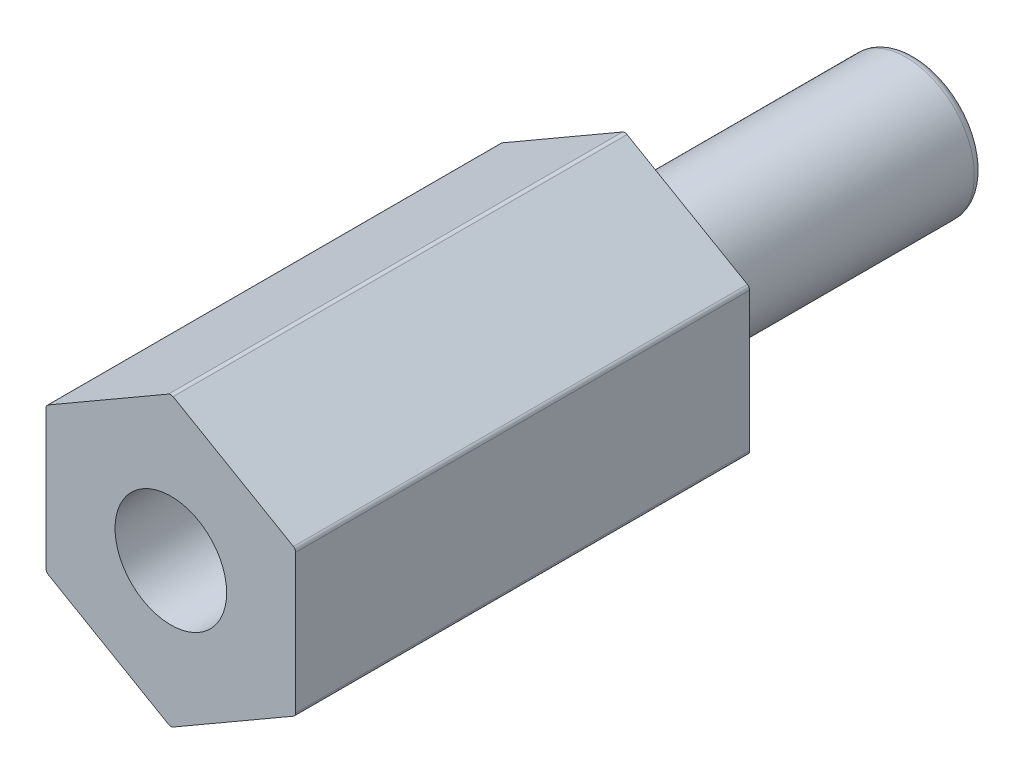
ISO-10303-21;
HEADER;
FILE_DESCRIPTION(('STEP AP214'),'2;1');
FILE_NAME('part.step','',(''),(''),'','','');
FILE_SCHEMA(('AUTOMOTIVE_DESIGN { 1 0 10303 214 1 1 1 1 }'));
ENDSEC;
DATA;
#1=APPLICATION_CONTEXT('core data for automotive mechanical design processes');
#2=APPLICATION_PROTOCOL_DEFINITION('international standard','automotive_design',2000,#1);
#3=PRODUCT_CONTEXT('',#1,'mechanical');
#4=PRODUCT('Part','Part','',(#3));
#5=PRODUCT_RELATED_PRODUCT_CATEGORY('part','',(#4));
#6=PRODUCT_DEFINITION_FORMATION('','',#4);
#7=PRODUCT_DEFINITION_CONTEXT('part definition',#1,'design');
#8=PRODUCT_DEFINITION('design','',#6,#7);
#9=PRODUCT_DEFINITION_SHAPE('','',#8);
#10=(LENGTH_UNIT() NAMED_UNIT(*) SI_UNIT(.MILLI.,.METRE.));
#11=(NAMED_UNIT(*) PLANE_ANGLE_UNIT() SI_UNIT($,.RADIAN.));
#12=(NAMED_UNIT(*) SI_UNIT($,.STERADIAN.) SOLID_ANGLE_UNIT());
#13=UNCERTAINTY_MEASURE_WITH_UNIT(LENGTH_MEASURE(1.E-05),#10,'distance_accuracy_value','');
#14=(GEOMETRIC_REPRESENTATION_CONTEXT(3) GLOBAL_UNCERTAINTY_ASSIGNED_CONTEXT((#13)) GLOBAL_UNIT_ASSIGNED_CONTEXT((#10,
#11,#12)) REPRESENTATION_CONTEXT('',''));
#15=CARTESIAN_POINT('',(0.,0.,0.));
#16=DIRECTION('',(0.,0.,1.));
#17=DIRECTION('',(1.,0.,0.));
#18=AXIS2_PLACEMENT_3D('',#15,#16,#17);
#19=CARTESIAN_POINT('',(0.,0.,-6.2));
#20=DIRECTION('',(0.,0.,-1.));
#21=DIRECTION('',(-1.,0.,0.));
#22=AXIS2_PLACEMENT_3D('',#19,#20,#21);
#23=TOROIDAL_SURFACE('',#22,1.3,0.2);
#24=CARTESIAN_POINT('',(0.,0.,-6.2));
#25=DIRECTION('',(0.,0.,-1.));
#26=DIRECTION('',(1.,0.,0.));
#27=AXIS2_PLACEMENT_3D('',#24,#25,#26);
#28=CIRCLE('',#27,1.5);
#29=CARTESIAN_POINT('',(-1.5,0.,-6.2));
#30=VERTEX_POINT('',#29);
#31=EDGE_CURVE('E11',#30,#30,#28,.T.);
#32=ORIENTED_EDGE('',*,*,#31,.T.);
#33=EDGE_LOOP('',(#32));
#34=FACE_BOUND('',#33,.T.);
#35=CARTESIAN_POINT('',(0.,0.,-6.4));
#36=DIRECTION('',(0.,0.,1.));
#37=DIRECTION('',(1.,0.,0.));
#38=AXIS2_PLACEMENT_3D('',#35,#36,#37);
#39=CIRCLE('',#38,1.3);
#40=CARTESIAN_POINT('',(-1.3,0.,-6.4));
#41=VERTEX_POINT('',#40);
#42=EDGE_CURVE('E46',#41,#41,#39,.T.);
#43=ORIENTED_EDGE('',*,*,#42,.T.);
#44=EDGE_LOOP('',(#43));
#45=FACE_BOUND('',#44,.T.);
#46=ADVANCED_FACE('F36',(#34,#45),#23,.T.);
#47=CARTESIAN_POINT('',(0.,0.,0.));
#48=DIRECTION('',(0.,0.,-1.));
#49=DIRECTION('',(1.,0.,0.));
#50=AXIS2_PLACEMENT_3D('',#47,#48,#49);
#51=CYLINDRICAL_SURFACE('',#50,1.5);
#52=CARTESIAN_POINT('',(0.,0.,0.));
#53=DIRECTION('',(0.,0.,1.));
#54=DIRECTION('',(1.,0.,0.));
#55=AXIS2_PLACEMENT_3D('',#52,#53,#54);
#56=CIRCLE('',#55,1.5);
#57=CARTESIAN_POINT('',(-1.5,0.,0.));
#58=VERTEX_POINT('',#57);
#59=EDGE_CURVE('E170',#58,#58,#56,.T.);
#60=ORIENTED_EDGE('',*,*,#59,.F.);
#61=EDGE_LOOP('',(#60));
#62=FACE_BOUND('',#61,.T.);
#63=ORIENTED_EDGE('',*,*,#31,.F.);
#64=EDGE_LOOP('',(#63));
#65=FACE_BOUND('',#64,.T.);
#66=ADVANCED_FACE('F236',(#62,#65),#51,.T.);
#67=CARTESIAN_POINT('',(0.,0.,-6.4));
#68=DIRECTION('',(0.,0.,1.));
#69=DIRECTION('',(1.,0.,0.));
#70=AXIS2_PLACEMENT_3D('',#67,#68,#69);
#71=PLANE('',#70);
#72=ORIENTED_EDGE('',*,*,#42,.F.);
#73=EDGE_LOOP('',(#72));
#74=FACE_BOUND('',#73,.T.);
#75=ADVANCED_FACE('F233',(#74),#71,.F.);
#76=CARTESIAN_POINT('',(-2.65,-1.53230652808246,0.));
#77=DIRECTION('',(0.,0.,1.));
#78=DIRECTION('',(-0.866181221002111,-0.499730019493819,0.));
#79=AXIS2_PLACEMENT_3D('',#76,#77,#78);
#80=CYLINDRICAL_SURFACE('',#79,0.1);
#81=DIRECTION('',(0.,0.,1.));
#82=VECTOR('',#81,1.);
#83=CARTESIAN_POINT('',(-2.70005398152334,-1.61887787977378,0.));
#84=LINE('',#83,#82);
#85=CARTESIAN_POINT('',(-2.70005398152334,-1.61887787977378,0.));
#86=VERTEX_POINT('',#85);
#87=CARTESIAN_POINT('',(-2.70005398152334,-1.61887787977378,10.));
#88=VERTEX_POINT('',#87);
#89=EDGE_CURVE('E157',#86,#88,#84,.T.);
#90=ORIENTED_EDGE('',*,*,#89,.T.);
#91=CARTESIAN_POINT('',(-2.65,-1.53230652808246,10.));
#92=DIRECTION('',(0.,0.,1.));
#93=DIRECTION('',(1.,0.,0.));
#94=AXIS2_PLACEMENT_3D('',#91,#92,#93);
#95=CIRCLE('',#94,0.100000000000002);
#96=CARTESIAN_POINT('',(-2.75,-1.53230652808246,10.));
#97=VERTEX_POINT('',#96);
#98=EDGE_CURVE('E282',#97,#88,#95,.T.);
#99=ORIENTED_EDGE('',*,*,#98,.F.);
#100=DIRECTION('',(0.,0.,-1.));
#101=VECTOR('',#100,1.);
#102=CARTESIAN_POINT('',(-2.75,-1.53230652808246,0.));
#103=LINE('',#102,#101);
#104=CARTESIAN_POINT('',(-2.75,-1.53230652808246,0.));
#105=VERTEX_POINT('',#104);
#106=EDGE_CURVE('E97',#97,#105,#103,.T.);
#107=ORIENTED_EDGE('',*,*,#106,.T.);
#108=CARTESIAN_POINT('',(-2.65,-1.53230652808246,0.));
#109=DIRECTION('',(0.,0.,1.));
#110=DIRECTION('',(-0.866181221002111,-0.499730019493819,0.));
#111=AXIS2_PLACEMENT_3D('',#108,#109,#110);
#112=CIRCLE('',#111,0.1);
#113=EDGE_CURVE('E218',#105,#86,#112,.T.);
#114=ORIENTED_EDGE('',*,*,#113,.T.);
#115=EDGE_LOOP('',(#90,#99,#107,#114));
#116=FACE_BOUND('',#115,.T.);
#117=ADVANCED_FACE('F235',(#116),#80,.T.);
#118=CARTESIAN_POINT('',(-2.75,1.59,0.));
#119=DIRECTION('',(-1.,0.,0.));
#120=DIRECTION('',(0.,0.,1.));
#121=AXIS2_PLACEMENT_3D('',#118,#119,#120);
#122=PLANE('',#121);
#123=ORIENTED_EDGE('',*,*,#106,.F.);
#124=DIRECTION('',(0.,-1.,0.));
#125=VECTOR('',#124,1.);
#126=CARTESIAN_POINT('',(-2.75,1.53230652808246,10.));
#127=LINE('',#126,#125);
#128=CARTESIAN_POINT('',(-2.75,1.53230652808246,10.));
#129=VERTEX_POINT('',#128);
#130=EDGE_CURVE('E172',#129,#97,#127,.T.);
#131=ORIENTED_EDGE('',*,*,#130,.F.);
#132=DIRECTION('',(0.,0.,1.));
#133=VECTOR('',#132,1.);
#134=CARTESIAN_POINT('',(-2.75,1.53230652808246,0.));
#135=LINE('',#134,#133);
#136=CARTESIAN_POINT('',(-2.75,1.53230652808246,0.));
#137=VERTEX_POINT('',#136);
#138=EDGE_CURVE('E162',#137,#129,#135,.T.);
#139=ORIENTED_EDGE('',*,*,#138,.F.);
#140=DIRECTION('',(0.,1.,0.));
#141=VECTOR('',#140,1.);
#142=CARTESIAN_POINT('',(-2.75,-1.59,0.));
#143=LINE('',#142,#141);
#144=EDGE_CURVE('E215',#105,#137,#143,.T.);
#145=ORIENTED_EDGE('',*,*,#144,.F.);
#146=EDGE_LOOP('',(#123,#131,#139,#145));
#147=FACE_BOUND('',#146,.T.);
#148=ADVANCED_FACE('F242',(#147),#122,.T.);
#149=CARTESIAN_POINT('',(0.,-3.06448834626428,0.));
#150=DIRECTION('',(0.,0.,1.));
#151=DIRECTION('',(0.,-1.,0.));
#152=AXIS2_PLACEMENT_3D('',#149,#150,#151);
#153=CYLINDRICAL_SURFACE('',#152,0.1);
#154=DIRECTION('',(0.,0.,1.));
#155=VECTOR('',#154,1.);
#156=CARTESIAN_POINT('',(0.0500539815233412,-3.15105969795559,0.));
#157=LINE('',#156,#155);
#158=CARTESIAN_POINT('',(0.0500539815233414,-3.15105969795559,0.));
#159=VERTEX_POINT('',#158);
#160=CARTESIAN_POINT('',(0.0500539815233435,-3.15105969795559,10.));
#161=VERTEX_POINT('',#160);
#162=EDGE_CURVE('E152',#159,#161,#157,.T.);
#163=ORIENTED_EDGE('',*,*,#162,.T.);
#164=CARTESIAN_POINT('',(0.,-3.06448834626428,10.));
#165=DIRECTION('',(0.,0.,1.));
#166=DIRECTION('',(1.,0.,0.));
#167=AXIS2_PLACEMENT_3D('',#164,#165,#166);
#168=CIRCLE('',#167,0.100000000000004);
#169=CARTESIAN_POINT('',(-0.0500539815233399,-3.1510596979556,10.));
#170=VERTEX_POINT('',#169);
#171=EDGE_CURVE('E289',#170,#161,#168,.T.);
#172=ORIENTED_EDGE('',*,*,#171,.F.);
#173=DIRECTION('',(0.,0.,-1.));
#174=VECTOR('',#173,1.);
#175=CARTESIAN_POINT('',(-0.0500539815233408,-3.15105969795559,0.));
#176=LINE('',#175,#174);
#177=CARTESIAN_POINT('',(-0.050053981523341,-3.1510596979556,0.));
#178=VERTEX_POINT('',#177);
#179=EDGE_CURVE('E154',#170,#178,#176,.T.);
#180=ORIENTED_EDGE('',*,*,#179,.T.);
#181=CARTESIAN_POINT('',(0.,-3.06448834626428,0.));
#182=DIRECTION('',(0.,0.,1.));
#183=DIRECTION('',(0.,-1.,0.));
#184=AXIS2_PLACEMENT_3D('',#181,#182,#183);
#185=CIRCLE('',#184,0.1);
#186=EDGE_CURVE('E158',#178,#159,#185,.T.);
#187=ORIENTED_EDGE('',*,*,#186,.T.);
#188=EDGE_LOOP('',(#163,#172,#180,#187));
#189=FACE_BOUND('',#188,.T.);
#190=ADVANCED_FACE('F315',(#189),#153,.T.);
#191=CARTESIAN_POINT('',(0.,-3.18,0.));
#192=DIRECTION('',(0.50053981523341,-0.865713516913132,0.));
#193=DIRECTION('',(0.,0.,-1.));
#194=AXIS2_PLACEMENT_3D('',#191,#192,#193);
#195=PLANE('',#194);
#196=ORIENTED_EDGE('',*,*,#162,.F.);
#197=DIRECTION('',(-0.865713516913132,-0.50053981523341,0.));
#198=VECTOR('',#197,1.);
#199=CARTESIAN_POINT('',(2.75,-1.59,0.));
#200=LINE('',#199,#198);
#201=CARTESIAN_POINT('',(2.70005398152334,-1.61887787977378,0.));
#202=VERTEX_POINT('',#201);
#203=EDGE_CURVE('E40',#202,#159,#200,.T.);
#204=ORIENTED_EDGE('',*,*,#203,.F.);
#205=DIRECTION('',(0.,0.,-1.));
#206=VECTOR('',#205,1.);
#207=CARTESIAN_POINT('',(2.70005398152334,-1.61887787977378,0.));
#208=LINE('',#207,#206);
#209=CARTESIAN_POINT('',(2.70005398152334,-1.61887787977378,10.));
#210=VERTEX_POINT('',#209);
#211=EDGE_CURVE('E135',#210,#202,#208,.T.);
#212=ORIENTED_EDGE('',*,*,#211,.F.);
#213=DIRECTION('',(0.865713516913132,0.50053981523341,0.));
#214=VECTOR('',#213,1.);
#215=CARTESIAN_POINT('',(0.0500539815233435,-3.15105969795559,10.));
#216=LINE('',#215,#214);
#217=EDGE_CURVE('E296',#161,#210,#216,.T.);
#218=ORIENTED_EDGE('',*,*,#217,.F.);
#219=EDGE_LOOP('',(#196,#204,#212,#218));
#220=FACE_BOUND('',#219,.T.);
#221=ADVANCED_FACE('F316',(#220),#195,.T.);
#222=CARTESIAN_POINT('',(2.65,-1.53230652808246,0.));
#223=DIRECTION('',(0.,0.,1.));
#224=DIRECTION('',(0.866181221002107,-0.499730019493825,0.));
#225=AXIS2_PLACEMENT_3D('',#222,#223,#224);
#226=CYLINDRICAL_SURFACE('',#225,0.1);
#227=DIRECTION('',(0.,0.,1.));
#228=VECTOR('',#227,1.);
#229=CARTESIAN_POINT('',(2.75,-1.53230652808246,0.));
#230=LINE('',#229,#228);
#231=CARTESIAN_POINT('',(2.75,-1.53230652808246,0.));
#232=VERTEX_POINT('',#231);
#233=CARTESIAN_POINT('',(2.75,-1.53230652808246,10.));
#234=VERTEX_POINT('',#233);
#235=EDGE_CURVE('E116',#232,#234,#230,.T.);
#236=ORIENTED_EDGE('',*,*,#235,.T.);
#237=CARTESIAN_POINT('',(2.65,-1.53230652808246,10.));
#238=DIRECTION('',(0.,0.,1.));
#239=DIRECTION('',(1.,0.,0.));
#240=AXIS2_PLACEMENT_3D('',#237,#238,#239);
#241=CIRCLE('',#240,0.100000000000004);
#242=EDGE_CURVE('E299',#210,#234,#241,.T.);
#243=ORIENTED_EDGE('',*,*,#242,.F.);
#244=ORIENTED_EDGE('',*,*,#211,.T.);
#245=CARTESIAN_POINT('',(2.65,-1.53230652808246,0.));
#246=DIRECTION('',(0.,0.,1.));
#247=DIRECTION('',(0.866181221002107,-0.499730019493825,0.));
#248=AXIS2_PLACEMENT_3D('',#245,#246,#247);
#249=CIRCLE('',#248,0.1);
#250=EDGE_CURVE('E128',#202,#232,#249,.T.);
#251=ORIENTED_EDGE('',*,*,#250,.T.);
#252=EDGE_LOOP('',(#236,#243,#244,#251));
#253=FACE_BOUND('',#252,.T.);
#254=ADVANCED_FACE('F133',(#253),#226,.T.);
#255=CARTESIAN_POINT('',(-2.65,1.53230652808246,0.));
#256=DIRECTION('',(0.,0.,1.));
#257=DIRECTION('',(-0.866181221002109,0.499730019493822,0.));
#258=AXIS2_PLACEMENT_3D('',#255,#256,#257);
#259=CYLINDRICAL_SURFACE('',#258,0.1);
#260=ORIENTED_EDGE('',*,*,#138,.T.);
#261=CARTESIAN_POINT('',(-2.65,1.53230652808246,10.));
#262=DIRECTION('',(0.,0.,1.));
#263=DIRECTION('',(1.,0.,0.));
#264=AXIS2_PLACEMENT_3D('',#261,#262,#263);
#265=CIRCLE('',#264,0.100000000000004);
#266=CARTESIAN_POINT('',(-2.70005398152334,1.61887787977378,10.));
#267=VERTEX_POINT('',#266);
#268=EDGE_CURVE('E205',#267,#129,#265,.T.);
#269=ORIENTED_EDGE('',*,*,#268,.F.);
#270=DIRECTION('',(0.,0.,-1.));
#271=VECTOR('',#270,1.);
#272=CARTESIAN_POINT('',(-2.70005398152334,1.61887787977378,0.));
#273=LINE('',#272,#271);
#274=CARTESIAN_POINT('',(-2.70005398152334,1.61887787977378,0.));
#275=VERTEX_POINT('',#274);
#276=EDGE_CURVE('E129',#267,#275,#273,.T.);
#277=ORIENTED_EDGE('',*,*,#276,.T.);
#278=CARTESIAN_POINT('',(-2.65,1.53230652808246,0.));
#279=DIRECTION('',(0.,0.,1.));
#280=DIRECTION('',(-0.866181221002109,0.499730019493822,0.));
#281=AXIS2_PLACEMENT_3D('',#278,#279,#280);
#282=CIRCLE('',#281,0.1);
#283=EDGE_CURVE('E164',#275,#137,#282,.T.);
#284=ORIENTED_EDGE('',*,*,#283,.T.);
#285=EDGE_LOOP('',(#260,#269,#277,#284));
#286=FACE_BOUND('',#285,.T.);
#287=ADVANCED_FACE('F256',(#286),#259,.T.);
#288=CARTESIAN_POINT('',(0.,3.18,0.));
#289=DIRECTION('',(-0.500539815233411,0.865713516913132,0.));
#290=DIRECTION('',(0.,0.,1.));
#291=AXIS2_PLACEMENT_3D('',#288,#289,#290);
#292=PLANE('',#291);
#293=ORIENTED_EDGE('',*,*,#276,.F.);
#294=DIRECTION('',(-0.865713516913133,-0.500539815233409,0.));
#295=VECTOR('',#294,1.);
#296=CARTESIAN_POINT('',(-0.0500539815233419,3.15105969795559,10.));
#297=LINE('',#296,#295);
#298=CARTESIAN_POINT('',(-0.0500539815233419,3.15105969795559,10.));
#299=VERTEX_POINT('',#298);
#300=EDGE_CURVE('E199',#299,#267,#297,.T.);
#301=ORIENTED_EDGE('',*,*,#300,.F.);
#302=DIRECTION('',(0.,0.,1.));
#303=VECTOR('',#302,1.);
#304=CARTESIAN_POINT('',(-0.0500539815233414,3.15105969795559,0.));
#305=LINE('',#304,#303);
#306=CARTESIAN_POINT('',(-0.050053981523342,3.15105969795559,0.));
#307=VERTEX_POINT('',#306);
#308=EDGE_CURVE('E161',#307,#299,#305,.T.);
#309=ORIENTED_EDGE('',*,*,#308,.F.);
#310=DIRECTION('',(0.865713516913132,0.500539815233411,0.));
#311=VECTOR('',#310,1.);
#312=CARTESIAN_POINT('',(-2.75,1.59,0.));
#313=LINE('',#312,#311);
#314=EDGE_CURVE('E145',#275,#307,#313,.T.);
#315=ORIENTED_EDGE('',*,*,#314,.F.);
#316=EDGE_LOOP('',(#293,#301,#309,#315));
#317=FACE_BOUND('',#316,.T.);
#318=ADVANCED_FACE('F277',(#317),#292,.T.);
#319=CARTESIAN_POINT('',(2.65,1.53230652808246,0.));
#320=DIRECTION('',(0.,0.,1.));
#321=DIRECTION('',(0.866181221002109,0.499730019493822,0.));
#322=AXIS2_PLACEMENT_3D('',#319,#320,#321);
#323=CYLINDRICAL_SURFACE('',#322,0.1);
#324=DIRECTION('',(0.,0.,1.));
#325=VECTOR('',#324,1.);
#326=CARTESIAN_POINT('',(2.70005398152334,1.61887787977378,0.));
#327=LINE('',#326,#325);
#328=CARTESIAN_POINT('',(2.70005398152334,1.61887787977378,0.));
#329=VERTEX_POINT('',#328);
#330=CARTESIAN_POINT('',(2.70005398152334,1.61887787977378,10.));
#331=VERTEX_POINT('',#330);
#332=EDGE_CURVE('E166',#329,#331,#327,.T.);
#333=ORIENTED_EDGE('',*,*,#332,.T.);
#334=CARTESIAN_POINT('',(2.65,1.53230652808246,10.));
#335=DIRECTION('',(0.,0.,1.));
#336=DIRECTION('',(1.,0.,0.));
#337=AXIS2_PLACEMENT_3D('',#334,#335,#336);
#338=CIRCLE('',#337,0.100000000000001);
#339=CARTESIAN_POINT('',(2.75,1.53230652808246,10.));
#340=VERTEX_POINT('',#339);
#341=EDGE_CURVE('E180',#340,#331,#338,.T.);
#342=ORIENTED_EDGE('',*,*,#341,.F.);
#343=DIRECTION('',(0.,0.,-1.));
#344=VECTOR('',#343,1.);
#345=CARTESIAN_POINT('',(2.75,1.53230652808246,0.));
#346=LINE('',#345,#344);
#347=CARTESIAN_POINT('',(2.75,1.53230652808246,0.));
#348=VERTEX_POINT('',#347);
#349=EDGE_CURVE('E150',#340,#348,#346,.T.);
#350=ORIENTED_EDGE('',*,*,#349,.T.);
#351=CARTESIAN_POINT('',(2.65,1.53230652808246,0.));
#352=DIRECTION('',(0.,0.,1.));
#353=DIRECTION('',(0.866181221002109,0.499730019493822,0.));
#354=AXIS2_PLACEMENT_3D('',#351,#352,#353);
#355=CIRCLE('',#354,0.1);
#356=EDGE_CURVE('E141',#348,#329,#355,.T.);
#357=ORIENTED_EDGE('',*,*,#356,.T.);
#358=EDGE_LOOP('',(#333,#342,#350,#357));
#359=FACE_BOUND('',#358,.T.);
#360=ADVANCED_FACE('F178',(#359),#323,.T.);
#361=CARTESIAN_POINT('',(2.75,-1.59,0.));
#362=DIRECTION('',(1.,0.,0.));
#363=DIRECTION('',(0.,1.,0.));
#364=AXIS2_PLACEMENT_3D('',#361,#362,#363);
#365=PLANE('',#364);
#366=ORIENTED_EDGE('',*,*,#235,.F.);
#367=DIRECTION('',(0.,-1.,0.));
#368=VECTOR('',#367,1.);
#369=CARTESIAN_POINT('',(2.75,1.59,0.));
#370=LINE('',#369,#368);
#371=EDGE_CURVE('E121',#348,#232,#370,.T.);
#372=ORIENTED_EDGE('',*,*,#371,.F.);
#373=ORIENTED_EDGE('',*,*,#349,.F.);
#374=DIRECTION('',(0.,1.,0.));
#375=VECTOR('',#374,1.);
#376=CARTESIAN_POINT('',(2.75,-1.53230652808246,10.));
#377=LINE('',#376,#375);
#378=EDGE_CURVE('E124',#234,#340,#377,.T.);
#379=ORIENTED_EDGE('',*,*,#378,.F.);
#380=EDGE_LOOP('',(#366,#372,#373,#379));
#381=FACE_BOUND('',#380,.T.);
#382=ADVANCED_FACE('F118',(#381),#365,.T.);
#383=CARTESIAN_POINT('',(0.,3.06448834626428,0.));
#384=DIRECTION('',(0.,0.,1.));
#385=DIRECTION('',(0.,1.,0.));
#386=AXIS2_PLACEMENT_3D('',#383,#384,#385);
#387=CYLINDRICAL_SURFACE('',#386,0.1);
#388=ORIENTED_EDGE('',*,*,#308,.T.);
#389=CARTESIAN_POINT('',(0.,3.06448834626428,10.));
#390=DIRECTION('',(0.,0.,1.));
#391=DIRECTION('',(1.,0.,0.));
#392=AXIS2_PLACEMENT_3D('',#389,#390,#391);
#393=CIRCLE('',#392,0.0999999999999977);
#394=CARTESIAN_POINT('',(0.0500539815233409,3.15105969795559,10.));
#395=VERTEX_POINT('',#394);
#396=EDGE_CURVE('E197',#395,#299,#393,.T.);
#397=ORIENTED_EDGE('',*,*,#396,.F.);
#398=DIRECTION('',(0.,0.,-1.));
#399=VECTOR('',#398,1.);
#400=CARTESIAN_POINT('',(0.050053981523341,3.1510596979556,0.));
#401=LINE('',#400,#399);
#402=CARTESIAN_POINT('',(0.0500539815233408,3.15105969795559,0.));
#403=VERTEX_POINT('',#402);
#404=EDGE_CURVE('E160',#395,#403,#401,.T.);
#405=ORIENTED_EDGE('',*,*,#404,.T.);
#406=CARTESIAN_POINT('',(0.,3.06448834626428,0.));
#407=DIRECTION('',(0.,0.,1.));
#408=DIRECTION('',(0.,1.,0.));
#409=AXIS2_PLACEMENT_3D('',#406,#407,#408);
#410=CIRCLE('',#409,0.1);
#411=EDGE_CURVE('E85',#403,#307,#410,.T.);
#412=ORIENTED_EDGE('',*,*,#411,.T.);
#413=EDGE_LOOP('',(#388,#397,#405,#412));
#414=FACE_BOUND('',#413,.T.);
#415=ADVANCED_FACE('F38',(#414),#387,.T.);
#416=CARTESIAN_POINT('',(2.75,1.59,0.));
#417=DIRECTION('',(0.500539815233411,0.865713516913132,0.));
#418=DIRECTION('',(0.,0.,-1.));
#419=AXIS2_PLACEMENT_3D('',#416,#417,#418);
#420=PLANE('',#419);
#421=ORIENTED_EDGE('',*,*,#332,.F.);
#422=DIRECTION('',(0.865713516913132,-0.500539815233411,0.));
#423=VECTOR('',#422,1.);
#424=CARTESIAN_POINT('',(0.,3.18,0.));
#425=LINE('',#424,#423);
#426=EDGE_CURVE('E143',#403,#329,#425,.T.);
#427=ORIENTED_EDGE('',*,*,#426,.F.);
#428=ORIENTED_EDGE('',*,*,#404,.F.);
#429=DIRECTION('',(-0.865713516913132,0.50053981523341,0.));
#430=VECTOR('',#429,1.);
#431=CARTESIAN_POINT('',(2.70005398152334,1.61887787977378,10.));
#432=LINE('',#431,#430);
#433=EDGE_CURVE('E192',#331,#395,#432,.T.);
#434=ORIENTED_EDGE('',*,*,#433,.F.);
#435=EDGE_LOOP('',(#421,#427,#428,#434));
#436=FACE_BOUND('',#435,.T.);
#437=ADVANCED_FACE('F196',(#436),#420,.T.);
#438=CARTESIAN_POINT('',(-2.75,-1.59,0.));
#439=DIRECTION('',(-0.50053981523341,-0.865713516913132,0.));
#440=DIRECTION('',(-0.865713516913132,0.50053981523341,0.));
#441=AXIS2_PLACEMENT_3D('',#438,#439,#440);
#442=PLANE('',#441);
#443=ORIENTED_EDGE('',*,*,#89,.F.);
#444=DIRECTION('',(-0.865713516913132,0.50053981523341,0.));
#445=VECTOR('',#444,1.);
#446=CARTESIAN_POINT('',(0.,-3.18,0.));
#447=LINE('',#446,#445);
#448=EDGE_CURVE('E147',#178,#86,#447,.T.);
#449=ORIENTED_EDGE('',*,*,#448,.F.);
#450=ORIENTED_EDGE('',*,*,#179,.F.);
#451=DIRECTION('',(0.865713516913131,-0.500539815233412,0.));
#452=VECTOR('',#451,1.);
#453=CARTESIAN_POINT('',(-2.70005398152334,-1.61887787977378,10.));
#454=LINE('',#453,#452);
#455=EDGE_CURVE('E286',#88,#170,#454,.T.);
#456=ORIENTED_EDGE('',*,*,#455,.F.);
#457=EDGE_LOOP('',(#443,#449,#450,#456));
#458=FACE_BOUND('',#457,.T.);
#459=ADVANCED_FACE('F259',(#458),#442,.T.);
#460=CARTESIAN_POINT('',(0.,0.,0.));
#461=DIRECTION('',(0.,0.,1.));
#462=DIRECTION('',(1.,0.,0.));
#463=AXIS2_PLACEMENT_3D('',#460,#461,#462);
#464=PLANE('',#463);
#465=ORIENTED_EDGE('',*,*,#113,.F.);
#466=ORIENTED_EDGE('',*,*,#144,.T.);
#467=ORIENTED_EDGE('',*,*,#283,.F.);
#468=ORIENTED_EDGE('',*,*,#314,.T.);
#469=ORIENTED_EDGE('',*,*,#411,.F.);
#470=ORIENTED_EDGE('',*,*,#426,.T.);
#471=ORIENTED_EDGE('',*,*,#356,.F.);
#472=ORIENTED_EDGE('',*,*,#371,.T.);
#473=ORIENTED_EDGE('',*,*,#250,.F.);
#474=ORIENTED_EDGE('',*,*,#203,.T.);
#475=ORIENTED_EDGE('',*,*,#186,.F.);
#476=ORIENTED_EDGE('',*,*,#448,.T.);
#477=EDGE_LOOP('',(#465,#466,#467,#468,#469,#470,#471,#472,#473,#474,#475,#476));
#478=FACE_BOUND('',#477,.T.);
#479=ORIENTED_EDGE('',*,*,#59,.T.);
#480=EDGE_LOOP('',(#479));
#481=FACE_BOUND('',#480,.T.);
#482=ADVANCED_FACE('F138',(#478,#481),#464,.F.);
#483=CARTESIAN_POINT('',(-2.65,-1.53230652808246,10.));
#484=DIRECTION('',(0.,0.,1.));
#485=DIRECTION('',(1.,0.,0.));
#486=AXIS2_PLACEMENT_3D('',#483,#484,#485);
#487=PLANE('',#486);
#488=ORIENTED_EDGE('',*,*,#98,.T.);
#489=ORIENTED_EDGE('',*,*,#455,.T.);
#490=ORIENTED_EDGE('',*,*,#171,.T.);
#491=ORIENTED_EDGE('',*,*,#217,.T.);
#492=ORIENTED_EDGE('',*,*,#242,.T.);
#493=ORIENTED_EDGE('',*,*,#378,.T.);
#494=ORIENTED_EDGE('',*,*,#341,.T.);
#495=ORIENTED_EDGE('',*,*,#433,.T.);
#496=ORIENTED_EDGE('',*,*,#396,.T.);
#497=ORIENTED_EDGE('',*,*,#300,.T.);
#498=ORIENTED_EDGE('',*,*,#268,.T.);
#499=ORIENTED_EDGE('',*,*,#130,.T.);
#500=EDGE_LOOP('',(#488,#489,#490,#491,#492,#493,#494,#495,#496,#497,#498,#499));
#501=FACE_BOUND('',#500,.T.);
#502=CARTESIAN_POINT('',(0.,0.,10.));
#503=DIRECTION('',(0.,0.,1.));
#504=DIRECTION('',(1.,0.,0.));
#505=AXIS2_PLACEMENT_3D('',#502,#503,#504);
#506=CIRCLE('',#505,1.2295);
#507=CARTESIAN_POINT('',(1.2295,0.,10.));
#508=VERTEX_POINT('',#507);
#509=EDGE_CURVE('E287',#508,#508,#506,.T.);
#510=ORIENTED_EDGE('',*,*,#509,.F.);
#511=EDGE_LOOP('',(#510));
#512=FACE_BOUND('',#511,.T.);
#513=ADVANCED_FACE('F189',(#501,#512),#487,.T.);
#514=CARTESIAN_POINT('',(0.,0.,0.));
#515=DIRECTION('',(0.,0.,1.));
#516=DIRECTION('',(1.,0.,0.));
#517=AXIS2_PLACEMENT_3D('',#514,#515,#516);
#518=PLANE('',#517);
#519=CARTESIAN_POINT('',(0.,0.,0.));
#520=DIRECTION('',(0.,0.,1.));
#521=DIRECTION('',(1.,0.,0.));
#522=AXIS2_PLACEMENT_3D('',#519,#520,#521);
#523=CIRCLE('',#522,1.2295);
#524=CARTESIAN_POINT('',(-1.2295,0.,0.));
#525=VERTEX_POINT('',#524);
#526=EDGE_CURVE('E209',#525,#525,#523,.T.);
#527=ORIENTED_EDGE('',*,*,#526,.T.);
#528=EDGE_LOOP('',(#527));
#529=FACE_BOUND('',#528,.T.);
#530=ADVANCED_FACE('F336',(#529),#518,.T.);
#531=CARTESIAN_POINT('',(0.,0.,1.6));
#532=DIRECTION('',(0.,0.,1.));
#533=DIRECTION('',(1.,0.,0.));
#534=AXIS2_PLACEMENT_3D('',#531,#532,#533);
#535=CYLINDRICAL_SURFACE('',#534,1.2295);
#536=ORIENTED_EDGE('',*,*,#526,.F.);
#537=EDGE_LOOP('',(#536));
#538=FACE_BOUND('',#537,.T.);
#539=ORIENTED_EDGE('',*,*,#509,.T.);
#540=EDGE_LOOP('',(#539));
#541=FACE_BOUND('',#540,.T.);
#542=ADVANCED_FACE('F334',(#538,#541),#535,.F.);
#543=CLOSED_SHELL('',(#46,#66,#75,#117,#148,#190,#221,#254,#287,#318,#360,#382,#415,#437,#459,
#482,#513,#530,#542));
#544=MANIFOLD_SOLID_BREP('B2',#543);
#545=ADVANCED_BREP_SHAPE_REPRESENTATION('',(#18,#544),#14);
#546=SHAPE_DEFINITION_REPRESENTATION(#9,#545);
ENDSEC;
END-ISO-10303-21;
